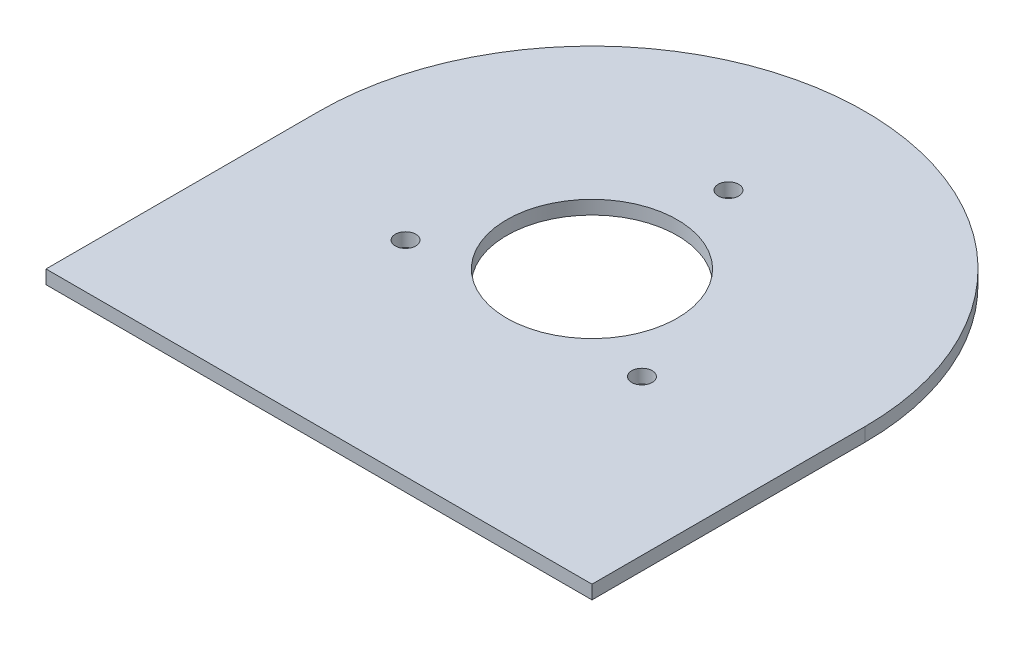
ISO-10303-21;
HEADER;
FILE_DESCRIPTION(('STEP AP214'),'2;1');
FILE_NAME('part.step','',(''),(''),'','','');
FILE_SCHEMA(('AUTOMOTIVE_DESIGN { 1 0 10303 214 1 1 1 1 }'));
ENDSEC;
DATA;
#1=APPLICATION_CONTEXT('core data for automotive mechanical design processes');
#2=APPLICATION_PROTOCOL_DEFINITION('international standard','automotive_design',2000,#1);
#3=PRODUCT_CONTEXT('',#1,'mechanical');
#4=PRODUCT('Part','Part','',(#3));
#5=PRODUCT_RELATED_PRODUCT_CATEGORY('part','',(#4));
#6=PRODUCT_DEFINITION_FORMATION('','',#4);
#7=PRODUCT_DEFINITION_CONTEXT('part definition',#1,'design');
#8=PRODUCT_DEFINITION('design','',#6,#7);
#9=PRODUCT_DEFINITION_SHAPE('','',#8);
#10=(LENGTH_UNIT() NAMED_UNIT(*) SI_UNIT(.MILLI.,.METRE.));
#11=(NAMED_UNIT(*) PLANE_ANGLE_UNIT() SI_UNIT($,.RADIAN.));
#12=(NAMED_UNIT(*) SI_UNIT($,.STERADIAN.) SOLID_ANGLE_UNIT());
#13=UNCERTAINTY_MEASURE_WITH_UNIT(LENGTH_MEASURE(1.E-05),#10,'distance_accuracy_value','');
#14=(GEOMETRIC_REPRESENTATION_CONTEXT(3) GLOBAL_UNCERTAINTY_ASSIGNED_CONTEXT((#13)) GLOBAL_UNIT_ASSIGNED_CONTEXT((#10,
#11,#12)) REPRESENTATION_CONTEXT('',''));
#15=CARTESIAN_POINT('',(0.,0.,0.));
#16=DIRECTION('',(0.,0.,1.));
#17=DIRECTION('',(1.,0.,0.));
#18=AXIS2_PLACEMENT_3D('',#15,#16,#17);
#19=CARTESIAN_POINT('',(40.,2.,-40.));
#20=DIRECTION('',(0.,-1.,0.));
#21=DIRECTION('',(0.,0.,-1.));
#22=AXIS2_PLACEMENT_3D('',#19,#20,#21);
#23=CYLINDRICAL_SURFACE('',#22,40.);
#24=DIRECTION('',(0.,-1.,0.));
#25=VECTOR('',#24,1.);
#26=CARTESIAN_POINT('',(0.,2.,-40.));
#27=LINE('',#26,#25);
#28=CARTESIAN_POINT('',(0.,2.,-40.));
#29=VERTEX_POINT('',#28);
#30=CARTESIAN_POINT('',(0.,0.,-40.));
#31=VERTEX_POINT('',#30);
#32=EDGE_CURVE('E112',#29,#31,#27,.T.);
#33=ORIENTED_EDGE('',*,*,#32,.F.);
#34=CARTESIAN_POINT('',(40.,2.,-40.));
#35=DIRECTION('',(0.,-1.,0.));
#36=DIRECTION('',(0.,0.,-1.));
#37=AXIS2_PLACEMENT_3D('',#34,#35,#36);
#38=CIRCLE('',#37,40.);
#39=CARTESIAN_POINT('',(80.,2.,-40.));
#40=VERTEX_POINT('',#39);
#41=EDGE_CURVE('E56',#40,#29,#38,.F.);
#42=ORIENTED_EDGE('',*,*,#41,.F.);
#43=DIRECTION('',(0.,-1.,0.));
#44=VECTOR('',#43,1.);
#45=CARTESIAN_POINT('',(80.,2.,-40.));
#46=LINE('',#45,#44);
#47=CARTESIAN_POINT('',(80.,0.,-40.));
#48=VERTEX_POINT('',#47);
#49=EDGE_CURVE('E116',#48,#40,#46,.F.);
#50=ORIENTED_EDGE('',*,*,#49,.F.);
#51=CARTESIAN_POINT('',(40.,0.,-40.));
#52=DIRECTION('',(0.,-1.,0.));
#53=DIRECTION('',(0.,0.,-1.));
#54=AXIS2_PLACEMENT_3D('',#51,#52,#53);
#55=CIRCLE('',#54,40.);
#56=EDGE_CURVE('E11',#31,#48,#55,.T.);
#57=ORIENTED_EDGE('',*,*,#56,.F.);
#58=EDGE_LOOP('',(#33,#42,#50,#57));
#59=FACE_BOUND('',#58,.T.);
#60=ADVANCED_FACE('F47',(#59),#23,.T.);
#61=CARTESIAN_POINT('',(0.,2.,0.));
#62=DIRECTION('',(1.,0.,0.));
#63=DIRECTION('',(0.,0.,-1.));
#64=AXIS2_PLACEMENT_3D('',#61,#62,#63);
#65=PLANE('',#64);
#66=DIRECTION('',(0.,0.,1.));
#67=VECTOR('',#66,1.);
#68=CARTESIAN_POINT('',(0.,2.,0.));
#69=LINE('',#68,#67);
#70=CARTESIAN_POINT('',(0.,2.,0.));
#71=VERTEX_POINT('',#70);
#72=EDGE_CURVE('E86',#29,#71,#69,.T.);
#73=ORIENTED_EDGE('',*,*,#72,.F.);
#74=ORIENTED_EDGE('',*,*,#32,.T.);
#75=DIRECTION('',(0.,0.,1.));
#76=VECTOR('',#75,1.);
#77=CARTESIAN_POINT('',(0.,0.,0.));
#78=LINE('',#77,#76);
#79=CARTESIAN_POINT('',(0.,0.,0.));
#80=VERTEX_POINT('',#79);
#81=EDGE_CURVE('E109',#31,#80,#78,.T.);
#82=ORIENTED_EDGE('',*,*,#81,.T.);
#83=DIRECTION('',(0.,-1.,0.));
#84=VECTOR('',#83,1.);
#85=CARTESIAN_POINT('',(0.,2.,0.));
#86=LINE('',#85,#84);
#87=EDGE_CURVE('E101',#71,#80,#86,.T.);
#88=ORIENTED_EDGE('',*,*,#87,.F.);
#89=EDGE_LOOP('',(#73,#74,#82,#88));
#90=FACE_BOUND('',#89,.T.);
#91=ADVANCED_FACE('F108',(#90),#65,.F.);
#92=CARTESIAN_POINT('',(0.,2.,0.));
#93=DIRECTION('',(0.,0.,-1.));
#94=DIRECTION('',(-1.,0.,0.));
#95=AXIS2_PLACEMENT_3D('',#92,#93,#94);
#96=PLANE('',#95);
#97=DIRECTION('',(1.,0.,0.));
#98=VECTOR('',#97,1.);
#99=CARTESIAN_POINT('',(0.,0.,0.));
#100=LINE('',#99,#98);
#101=CARTESIAN_POINT('',(80.,0.,0.));
#102=VERTEX_POINT('',#101);
#103=EDGE_CURVE('E131',#80,#102,#100,.T.);
#104=ORIENTED_EDGE('',*,*,#103,.T.);
#105=DIRECTION('',(0.,-1.,0.));
#106=VECTOR('',#105,1.);
#107=CARTESIAN_POINT('',(80.,2.,0.));
#108=LINE('',#107,#106);
#109=CARTESIAN_POINT('',(80.,2.,0.));
#110=VERTEX_POINT('',#109);
#111=EDGE_CURVE('E103',#110,#102,#108,.T.);
#112=ORIENTED_EDGE('',*,*,#111,.F.);
#113=DIRECTION('',(1.,0.,0.));
#114=VECTOR('',#113,1.);
#115=CARTESIAN_POINT('',(0.,2.,0.));
#116=LINE('',#115,#114);
#117=EDGE_CURVE('E90',#71,#110,#116,.T.);
#118=ORIENTED_EDGE('',*,*,#117,.F.);
#119=ORIENTED_EDGE('',*,*,#87,.T.);
#120=EDGE_LOOP('',(#104,#112,#118,#119));
#121=FACE_BOUND('',#120,.T.);
#122=ADVANCED_FACE('F100',(#121),#96,.F.);
#123=CARTESIAN_POINT('',(80.,2.,0.));
#124=DIRECTION('',(-1.,0.,0.));
#125=DIRECTION('',(0.,0.,1.));
#126=AXIS2_PLACEMENT_3D('',#123,#124,#125);
#127=PLANE('',#126);
#128=DIRECTION('',(0.,0.,-1.));
#129=VECTOR('',#128,1.);
#130=CARTESIAN_POINT('',(80.,0.,0.));
#131=LINE('',#130,#129);
#132=EDGE_CURVE('E96',#102,#48,#131,.T.);
#133=ORIENTED_EDGE('',*,*,#132,.T.);
#134=ORIENTED_EDGE('',*,*,#49,.T.);
#135=DIRECTION('',(0.,0.,-1.));
#136=VECTOR('',#135,1.);
#137=CARTESIAN_POINT('',(80.,2.,0.));
#138=LINE('',#137,#136);
#139=EDGE_CURVE('E106',#110,#40,#138,.T.);
#140=ORIENTED_EDGE('',*,*,#139,.F.);
#141=ORIENTED_EDGE('',*,*,#111,.T.);
#142=EDGE_LOOP('',(#133,#134,#140,#141));
#143=FACE_BOUND('',#142,.T.);
#144=ADVANCED_FACE('F125',(#143),#127,.F.);
#145=CARTESIAN_POINT('',(0.,2.,0.));
#146=DIRECTION('',(0.,-1.,0.));
#147=DIRECTION('',(0.,0.,-1.));
#148=AXIS2_PLACEMENT_3D('',#145,#146,#147);
#149=PLANE('',#148);
#150=CARTESIAN_POINT('',(22.68,2.,-30.0002933376357));
#151=DIRECTION('',(0.,1.,0.));
#152=DIRECTION('',(0.,0.,1.));
#153=AXIS2_PLACEMENT_3D('',#150,#151,#152);
#154=CIRCLE('',#153,1.5);
#155=CARTESIAN_POINT('',(22.68,2.,-28.5002933376357));
#156=VERTEX_POINT('',#155);
#157=EDGE_CURVE('E146',#156,#156,#154,.T.);
#158=ORIENTED_EDGE('',*,*,#157,.F.);
#159=EDGE_LOOP('',(#158));
#160=FACE_BOUND('',#159,.T.);
#161=CARTESIAN_POINT('',(57.32,2.,-30.0002933376357));
#162=DIRECTION('',(0.,1.,0.));
#163=DIRECTION('',(0.,0.,1.));
#164=AXIS2_PLACEMENT_3D('',#161,#162,#163);
#165=CIRCLE('',#164,1.5);
#166=CARTESIAN_POINT('',(57.32,2.,-28.5002933376357));
#167=VERTEX_POINT('',#166);
#168=EDGE_CURVE('E150',#167,#167,#165,.T.);
#169=ORIENTED_EDGE('',*,*,#168,.F.);
#170=EDGE_LOOP('',(#169));
#171=FACE_BOUND('',#170,.T.);
#172=CARTESIAN_POINT('',(39.9999999999999,2.,-59.9994133247286));
#173=DIRECTION('',(0.,1.,0.));
#174=DIRECTION('',(0.,0.,1.));
#175=AXIS2_PLACEMENT_3D('',#172,#173,#174);
#176=CIRCLE('',#175,1.5);
#177=CARTESIAN_POINT('',(39.9999999999999,2.,-58.4994133247286));
#178=VERTEX_POINT('',#177);
#179=EDGE_CURVE('E158',#178,#178,#176,.T.);
#180=ORIENTED_EDGE('',*,*,#179,.F.);
#181=EDGE_LOOP('',(#180));
#182=FACE_BOUND('',#181,.T.);
#183=CARTESIAN_POINT('',(40.,2.,-40.));
#184=DIRECTION('',(0.,1.,0.));
#185=DIRECTION('',(0.,0.,1.));
#186=AXIS2_PLACEMENT_3D('',#183,#184,#185);
#187=CIRCLE('',#186,12.5);
#188=CARTESIAN_POINT('',(40.,2.,-27.5));
#189=VERTEX_POINT('',#188);
#190=EDGE_CURVE('E138',#189,#189,#187,.T.);
#191=ORIENTED_EDGE('',*,*,#190,.F.);
#192=EDGE_LOOP('',(#191));
#193=FACE_BOUND('',#192,.T.);
#194=ORIENTED_EDGE('',*,*,#139,.T.);
#195=ORIENTED_EDGE('',*,*,#41,.T.);
#196=ORIENTED_EDGE('',*,*,#72,.T.);
#197=ORIENTED_EDGE('',*,*,#117,.T.);
#198=EDGE_LOOP('',(#194,#195,#196,#197));
#199=FACE_BOUND('',#198,.T.);
#200=ADVANCED_FACE('F89',(#160,#171,#182,#193,#199),#149,.F.);
#201=CARTESIAN_POINT('',(0.,0.,0.));
#202=DIRECTION('',(0.,-1.,0.));
#203=DIRECTION('',(0.,0.,-1.));
#204=AXIS2_PLACEMENT_3D('',#201,#202,#203);
#205=PLANE('',#204);
#206=CARTESIAN_POINT('',(22.68,0.,-30.0002933376357));
#207=DIRECTION('',(0.,1.,0.));
#208=DIRECTION('',(0.,0.,1.));
#209=AXIS2_PLACEMENT_3D('',#206,#207,#208);
#210=CIRCLE('',#209,1.5);
#211=CARTESIAN_POINT('',(22.68,0.,-28.5002933376357));
#212=VERTEX_POINT('',#211);
#213=EDGE_CURVE('E142',#212,#212,#210,.T.);
#214=ORIENTED_EDGE('',*,*,#213,.T.);
#215=EDGE_LOOP('',(#214));
#216=FACE_BOUND('',#215,.T.);
#217=CARTESIAN_POINT('',(57.32,0.,-30.0002933376357));
#218=DIRECTION('',(0.,1.,0.));
#219=DIRECTION('',(0.,0.,1.));
#220=AXIS2_PLACEMENT_3D('',#217,#218,#219);
#221=CIRCLE('',#220,1.5);
#222=CARTESIAN_POINT('',(57.32,0.,-28.5002933376357));
#223=VERTEX_POINT('',#222);
#224=EDGE_CURVE('E154',#223,#223,#221,.T.);
#225=ORIENTED_EDGE('',*,*,#224,.T.);
#226=EDGE_LOOP('',(#225));
#227=FACE_BOUND('',#226,.T.);
#228=CARTESIAN_POINT('',(39.9999999999999,0.,-59.9994133247286));
#229=DIRECTION('',(0.,1.,0.));
#230=DIRECTION('',(0.,0.,1.));
#231=AXIS2_PLACEMENT_3D('',#228,#229,#230);
#232=CIRCLE('',#231,1.5);
#233=CARTESIAN_POINT('',(39.9999999999999,0.,-58.4994133247286));
#234=VERTEX_POINT('',#233);
#235=EDGE_CURVE('E162',#234,#234,#232,.T.);
#236=ORIENTED_EDGE('',*,*,#235,.T.);
#237=EDGE_LOOP('',(#236));
#238=FACE_BOUND('',#237,.T.);
#239=CARTESIAN_POINT('',(40.,0.,-40.));
#240=DIRECTION('',(0.,1.,0.));
#241=DIRECTION('',(0.,0.,1.));
#242=AXIS2_PLACEMENT_3D('',#239,#240,#241);
#243=CIRCLE('',#242,12.5);
#244=CARTESIAN_POINT('',(40.,0.,-27.5));
#245=VERTEX_POINT('',#244);
#246=EDGE_CURVE('E132',#245,#245,#243,.T.);
#247=ORIENTED_EDGE('',*,*,#246,.T.);
#248=EDGE_LOOP('',(#247));
#249=FACE_BOUND('',#248,.T.);
#250=ORIENTED_EDGE('',*,*,#81,.F.);
#251=ORIENTED_EDGE('',*,*,#56,.T.);
#252=ORIENTED_EDGE('',*,*,#132,.F.);
#253=ORIENTED_EDGE('',*,*,#103,.F.);
#254=EDGE_LOOP('',(#250,#251,#252,#253));
#255=FACE_BOUND('',#254,.T.);
#256=ADVANCED_FACE('F168',(#216,#227,#238,#249,#255),#205,.T.);
#257=CARTESIAN_POINT('',(40.,0.,-40.));
#258=DIRECTION('',(0.,1.,0.));
#259=DIRECTION('',(0.,0.,1.));
#260=AXIS2_PLACEMENT_3D('',#257,#258,#259);
#261=CYLINDRICAL_SURFACE('',#260,12.5);
#262=ORIENTED_EDGE('',*,*,#246,.F.);
#263=EDGE_LOOP('',(#262));
#264=FACE_BOUND('',#263,.T.);
#265=ORIENTED_EDGE('',*,*,#190,.T.);
#266=EDGE_LOOP('',(#265));
#267=FACE_BOUND('',#266,.T.);
#268=ADVANCED_FACE('F175',(#264,#267),#261,.F.);
#269=CARTESIAN_POINT('',(39.9999999999999,0.,-59.9994133247286));
#270=DIRECTION('',(0.,1.,0.));
#271=DIRECTION('',(0.,0.,1.));
#272=AXIS2_PLACEMENT_3D('',#269,#270,#271);
#273=CYLINDRICAL_SURFACE('',#272,1.5);
#274=ORIENTED_EDGE('',*,*,#235,.F.);
#275=EDGE_LOOP('',(#274));
#276=FACE_BOUND('',#275,.T.);
#277=ORIENTED_EDGE('',*,*,#179,.T.);
#278=EDGE_LOOP('',(#277));
#279=FACE_BOUND('',#278,.T.);
#280=ADVANCED_FACE('F171',(#276,#279),#273,.F.);
#281=CARTESIAN_POINT('',(57.32,0.,-30.0002933376357));
#282=DIRECTION('',(0.,1.,0.));
#283=DIRECTION('',(0.,0.,1.));
#284=AXIS2_PLACEMENT_3D('',#281,#282,#283);
#285=CYLINDRICAL_SURFACE('',#284,1.5);
#286=ORIENTED_EDGE('',*,*,#224,.F.);
#287=EDGE_LOOP('',(#286));
#288=FACE_BOUND('',#287,.T.);
#289=ORIENTED_EDGE('',*,*,#168,.T.);
#290=EDGE_LOOP('',(#289));
#291=FACE_BOUND('',#290,.T.);
#292=ADVANCED_FACE('F174',(#288,#291),#285,.F.);
#293=CARTESIAN_POINT('',(22.68,0.,-30.0002933376357));
#294=DIRECTION('',(0.,1.,0.));
#295=DIRECTION('',(0.,0.,1.));
#296=AXIS2_PLACEMENT_3D('',#293,#294,#295);
#297=CYLINDRICAL_SURFACE('',#296,1.5);
#298=ORIENTED_EDGE('',*,*,#213,.F.);
#299=EDGE_LOOP('',(#298));
#300=FACE_BOUND('',#299,.T.);
#301=ORIENTED_EDGE('',*,*,#157,.T.);
#302=EDGE_LOOP('',(#301));
#303=FACE_BOUND('',#302,.T.);
#304=ADVANCED_FACE('F238',(#300,#303),#297,.F.);
#305=CLOSED_SHELL('',(#60,#91,#122,#144,#200,#256,#268,#280,#292,#304));
#306=MANIFOLD_SOLID_BREP('B2',#305);
#307=ADVANCED_BREP_SHAPE_REPRESENTATION('',(#18,#306),#14);
#308=SHAPE_DEFINITION_REPRESENTATION(#9,#307);
ENDSEC;
END-ISO-10303-21;
